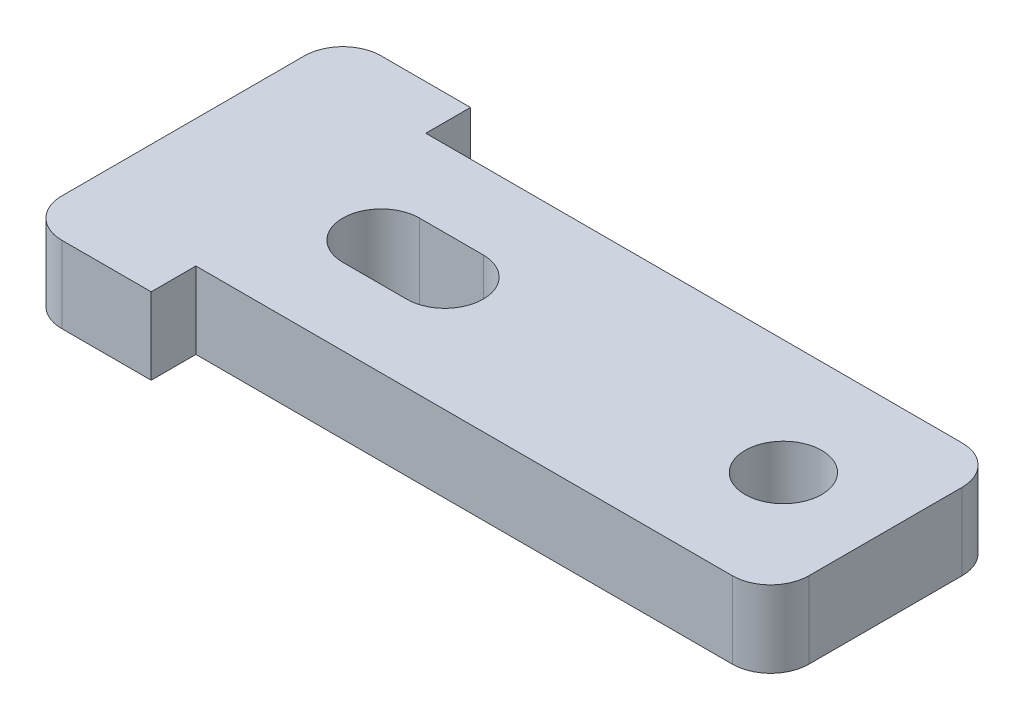
ISO-10303-21;
HEADER;
FILE_DESCRIPTION(('STEP AP214'),'2;1');
FILE_NAME('part.step','',(''),(''),'','','');
FILE_SCHEMA(('AUTOMOTIVE_DESIGN { 1 0 10303 214 1 1 1 1 }'));
ENDSEC;
DATA;
#1=APPLICATION_CONTEXT('core data for automotive mechanical design processes');
#2=APPLICATION_PROTOCOL_DEFINITION('international standard','automotive_design',2000,#1);
#3=PRODUCT_CONTEXT('',#1,'mechanical');
#4=PRODUCT('Part','Part','',(#3));
#5=PRODUCT_RELATED_PRODUCT_CATEGORY('part','',(#4));
#6=PRODUCT_DEFINITION_FORMATION('','',#4);
#7=PRODUCT_DEFINITION_CONTEXT('part definition',#1,'design');
#8=PRODUCT_DEFINITION('design','',#6,#7);
#9=PRODUCT_DEFINITION_SHAPE('','',#8);
#10=(LENGTH_UNIT() NAMED_UNIT(*) SI_UNIT(.MILLI.,.METRE.));
#11=(NAMED_UNIT(*) PLANE_ANGLE_UNIT() SI_UNIT($,.RADIAN.));
#12=(NAMED_UNIT(*) SI_UNIT($,.STERADIAN.) SOLID_ANGLE_UNIT());
#13=UNCERTAINTY_MEASURE_WITH_UNIT(LENGTH_MEASURE(1.E-05),#10,'distance_accuracy_value','');
#14=(GEOMETRIC_REPRESENTATION_CONTEXT(3) GLOBAL_UNCERTAINTY_ASSIGNED_CONTEXT((#13)) GLOBAL_UNIT_ASSIGNED_CONTEXT((#10,
#11,#12)) REPRESENTATION_CONTEXT('',''));
#15=CARTESIAN_POINT('',(0.,0.,0.));
#16=DIRECTION('',(0.,0.,1.));
#17=DIRECTION('',(1.,0.,0.));
#18=AXIS2_PLACEMENT_3D('',#15,#16,#17);
#19=CARTESIAN_POINT('',(26.,3.,-3.));
#20=DIRECTION('',(0.,1.,0.));
#21=DIRECTION('',(0.,0.,1.));
#22=AXIS2_PLACEMENT_3D('',#19,#20,#21);
#23=PLANE('',#22);
#24=DIRECTION('',(1.,0.,0.));
#25=VECTOR('',#24,1.);
#26=CARTESIAN_POINT('',(7.75,3.,1.5));
#27=LINE('',#26,#25);
#28=CARTESIAN_POINT('',(7.75,3.,1.5));
#29=VERTEX_POINT('',#28);
#30=CARTESIAN_POINT('',(10.25,3.,1.5));
#31=VERTEX_POINT('',#30);
#32=EDGE_CURVE('E162',#29,#31,#27,.T.);
#33=ORIENTED_EDGE('',*,*,#32,.F.);
#34=CARTESIAN_POINT('',(7.75,3.,0.));
#35=DIRECTION('',(0.,1.,0.));
#36=DIRECTION('',(0.,0.,1.));
#37=AXIS2_PLACEMENT_3D('',#34,#35,#36);
#38=CIRCLE('',#37,1.5);
#39=CARTESIAN_POINT('',(7.75,3.,-1.5));
#40=VERTEX_POINT('',#39);
#41=EDGE_CURVE('E153',#40,#29,#38,.T.);
#42=ORIENTED_EDGE('',*,*,#41,.F.);
#43=DIRECTION('',(-1.,0.,0.));
#44=VECTOR('',#43,1.);
#45=CARTESIAN_POINT('',(7.75,3.,-1.5));
#46=LINE('',#45,#44);
#47=CARTESIAN_POINT('',(10.25,3.,-1.5));
#48=VERTEX_POINT('',#47);
#49=EDGE_CURVE('E180',#48,#40,#46,.T.);
#50=ORIENTED_EDGE('',*,*,#49,.F.);
#51=CARTESIAN_POINT('',(10.25,3.,0.));
#52=DIRECTION('',(0.,1.,0.));
#53=DIRECTION('',(0.,0.,1.));
#54=AXIS2_PLACEMENT_3D('',#51,#52,#53);
#55=CIRCLE('',#54,1.5);
#56=EDGE_CURVE('E176',#31,#48,#55,.T.);
#57=ORIENTED_EDGE('',*,*,#56,.F.);
#58=EDGE_LOOP('',(#33,#42,#50,#57));
#59=FACE_BOUND('',#58,.T.);
#60=DIRECTION('',(0.,0.,-1.));
#61=VECTOR('',#60,1.);
#62=CARTESIAN_POINT('',(5.,3.,-6.25));
#63=LINE('',#62,#61);
#64=CARTESIAN_POINT('',(5.,3.,-4.5));
#65=VERTEX_POINT('',#64);
#66=CARTESIAN_POINT('',(5.,3.,-6.25));
#67=VERTEX_POINT('',#66);
#68=EDGE_CURVE('E204',#65,#67,#63,.T.);
#69=ORIENTED_EDGE('',*,*,#68,.T.);
#70=DIRECTION('',(-1.,0.,0.));
#71=VECTOR('',#70,1.);
#72=CARTESIAN_POINT('',(1.5,3.,-6.25));
#73=LINE('',#72,#71);
#74=CARTESIAN_POINT('',(1.5,3.,-6.25));
#75=VERTEX_POINT('',#74);
#76=EDGE_CURVE('E208',#67,#75,#73,.T.);
#77=ORIENTED_EDGE('',*,*,#76,.T.);
#78=CARTESIAN_POINT('',(1.5,3.,-4.75));
#79=DIRECTION('',(0.,1.,0.));
#80=DIRECTION('',(0.,0.,-1.));
#81=AXIS2_PLACEMENT_3D('',#78,#79,#80);
#82=CIRCLE('',#81,1.5);
#83=CARTESIAN_POINT('',(0.,3.,-4.75));
#84=VERTEX_POINT('',#83);
#85=EDGE_CURVE('E212',#75,#84,#82,.T.);
#86=ORIENTED_EDGE('',*,*,#85,.T.);
#87=DIRECTION('',(0.,0.,1.));
#88=VECTOR('',#87,1.);
#89=CARTESIAN_POINT('',(0.,3.,-4.75));
#90=LINE('',#89,#88);
#91=CARTESIAN_POINT('',(0.,3.,4.75));
#92=VERTEX_POINT('',#91);
#93=EDGE_CURVE('E215',#84,#92,#90,.T.);
#94=ORIENTED_EDGE('',*,*,#93,.T.);
#95=CARTESIAN_POINT('',(1.5,3.,4.75));
#96=DIRECTION('',(0.,1.,0.));
#97=DIRECTION('',(0.,0.,-1.));
#98=AXIS2_PLACEMENT_3D('',#95,#96,#97);
#99=CIRCLE('',#98,1.5);
#100=CARTESIAN_POINT('',(1.5,3.,6.25));
#101=VERTEX_POINT('',#100);
#102=EDGE_CURVE('E218',#92,#101,#99,.T.);
#103=ORIENTED_EDGE('',*,*,#102,.T.);
#104=DIRECTION('',(1.,0.,0.));
#105=VECTOR('',#104,1.);
#106=CARTESIAN_POINT('',(5.,3.,6.25));
#107=LINE('',#106,#105);
#108=CARTESIAN_POINT('',(5.,3.,6.25));
#109=VERTEX_POINT('',#108);
#110=EDGE_CURVE('E221',#101,#109,#107,.T.);
#111=ORIENTED_EDGE('',*,*,#110,.T.);
#112=DIRECTION('',(0.,0.,-1.));
#113=VECTOR('',#112,1.);
#114=CARTESIAN_POINT('',(5.,3.,4.5));
#115=LINE('',#114,#113);
#116=CARTESIAN_POINT('',(5.,3.,4.5));
#117=VERTEX_POINT('',#116);
#118=EDGE_CURVE('E224',#109,#117,#115,.T.);
#119=ORIENTED_EDGE('',*,*,#118,.T.);
#120=DIRECTION('',(1.,0.,0.));
#121=VECTOR('',#120,1.);
#122=CARTESIAN_POINT('',(26.,3.,4.5));
#123=LINE('',#122,#121);
#124=CARTESIAN_POINT('',(26.,3.,4.5));
#125=VERTEX_POINT('',#124);
#126=EDGE_CURVE('E227',#117,#125,#123,.T.);
#127=ORIENTED_EDGE('',*,*,#126,.T.);
#128=CARTESIAN_POINT('',(26.,3.,3.));
#129=DIRECTION('',(0.,1.,0.));
#130=DIRECTION('',(0.,0.,-1.));
#131=AXIS2_PLACEMENT_3D('',#128,#129,#130);
#132=CIRCLE('',#131,1.5);
#133=CARTESIAN_POINT('',(27.5,3.,3.));
#134=VERTEX_POINT('',#133);
#135=EDGE_CURVE('E230',#125,#134,#132,.T.);
#136=ORIENTED_EDGE('',*,*,#135,.T.);
#137=DIRECTION('',(0.,0.,-1.));
#138=VECTOR('',#137,1.);
#139=CARTESIAN_POINT('',(27.5,3.,-3.));
#140=LINE('',#139,#138);
#141=CARTESIAN_POINT('',(27.5,3.,-3.));
#142=VERTEX_POINT('',#141);
#143=EDGE_CURVE('E233',#134,#142,#140,.T.);
#144=ORIENTED_EDGE('',*,*,#143,.T.);
#145=CARTESIAN_POINT('',(26.,3.,-3.));
#146=DIRECTION('',(0.,1.,0.));
#147=DIRECTION('',(0.,0.,1.));
#148=AXIS2_PLACEMENT_3D('',#145,#146,#147);
#149=CIRCLE('',#148,1.5);
#150=CARTESIAN_POINT('',(26.,3.,-4.5));
#151=VERTEX_POINT('',#150);
#152=EDGE_CURVE('E236',#142,#151,#149,.T.);
#153=ORIENTED_EDGE('',*,*,#152,.T.);
#154=DIRECTION('',(-1.,0.,0.));
#155=VECTOR('',#154,1.);
#156=CARTESIAN_POINT('',(5.,3.,-4.5));
#157=LINE('',#156,#155);
#158=EDGE_CURVE('E239',#151,#65,#157,.T.);
#159=ORIENTED_EDGE('',*,*,#158,.T.);
#160=EDGE_LOOP('',(#69,#77,#86,#94,#103,#111,#119,#127,#136,#144,#153,#159));
#161=FACE_BOUND('',#160,.T.);
#162=CARTESIAN_POINT('',(23.5,3.,0.));
#163=DIRECTION('',(0.,1.,0.));
#164=DIRECTION('',(0.,0.,1.));
#165=AXIS2_PLACEMENT_3D('',#162,#163,#164);
#166=CIRCLE('',#165,1.5);
#167=CARTESIAN_POINT('',(23.5,3.,1.5));
#168=VERTEX_POINT('',#167);
#169=EDGE_CURVE('E188',#168,#168,#166,.T.);
#170=ORIENTED_EDGE('',*,*,#169,.F.);
#171=EDGE_LOOP('',(#170));
#172=FACE_BOUND('',#171,.T.);
#173=ADVANCED_FACE('F39',(#59,#161,#172),#23,.T.);
#174=CARTESIAN_POINT('',(26.,0.,-3.));
#175=DIRECTION('',(0.,1.,0.));
#176=DIRECTION('',(0.,0.,1.));
#177=AXIS2_PLACEMENT_3D('',#174,#175,#176);
#178=PLANE('',#177);
#179=DIRECTION('',(0.,0.,-1.));
#180=VECTOR('',#179,1.);
#181=CARTESIAN_POINT('',(5.,0.,-6.25));
#182=LINE('',#181,#180);
#183=CARTESIAN_POINT('',(5.,0.,-4.5));
#184=VERTEX_POINT('',#183);
#185=CARTESIAN_POINT('',(5.,0.,-6.25));
#186=VERTEX_POINT('',#185);
#187=EDGE_CURVE('E171',#184,#186,#182,.T.);
#188=ORIENTED_EDGE('',*,*,#187,.F.);
#189=DIRECTION('',(-1.,0.,0.));
#190=VECTOR('',#189,1.);
#191=CARTESIAN_POINT('',(5.,0.,-4.5));
#192=LINE('',#191,#190);
#193=CARTESIAN_POINT('',(26.,0.,-4.5));
#194=VERTEX_POINT('',#193);
#195=EDGE_CURVE('E209',#194,#184,#192,.T.);
#196=ORIENTED_EDGE('',*,*,#195,.F.);
#197=CARTESIAN_POINT('',(26.,0.,-3.));
#198=DIRECTION('',(0.,1.,0.));
#199=DIRECTION('',(0.,0.,1.));
#200=AXIS2_PLACEMENT_3D('',#197,#198,#199);
#201=CIRCLE('',#200,1.5);
#202=CARTESIAN_POINT('',(27.5,0.,-3.));
#203=VERTEX_POINT('',#202);
#204=EDGE_CURVE('E273',#203,#194,#201,.T.);
#205=ORIENTED_EDGE('',*,*,#204,.F.);
#206=DIRECTION('',(0.,0.,-1.));
#207=VECTOR('',#206,1.);
#208=CARTESIAN_POINT('',(27.5,0.,-3.));
#209=LINE('',#208,#207);
#210=CARTESIAN_POINT('',(27.5,0.,3.));
#211=VERTEX_POINT('',#210);
#212=EDGE_CURVE('E270',#211,#203,#209,.T.);
#213=ORIENTED_EDGE('',*,*,#212,.F.);
#214=CARTESIAN_POINT('',(26.,0.,3.));
#215=DIRECTION('',(0.,1.,0.));
#216=DIRECTION('',(0.,0.,-1.));
#217=AXIS2_PLACEMENT_3D('',#214,#215,#216);
#218=CIRCLE('',#217,1.5);
#219=CARTESIAN_POINT('',(26.,0.,4.5));
#220=VERTEX_POINT('',#219);
#221=EDGE_CURVE('E267',#220,#211,#218,.T.);
#222=ORIENTED_EDGE('',*,*,#221,.F.);
#223=DIRECTION('',(1.,0.,0.));
#224=VECTOR('',#223,1.);
#225=CARTESIAN_POINT('',(26.,0.,4.5));
#226=LINE('',#225,#224);
#227=CARTESIAN_POINT('',(5.,0.,4.5));
#228=VERTEX_POINT('',#227);
#229=EDGE_CURVE('E264',#228,#220,#226,.T.);
#230=ORIENTED_EDGE('',*,*,#229,.F.);
#231=DIRECTION('',(0.,0.,-1.));
#232=VECTOR('',#231,1.);
#233=CARTESIAN_POINT('',(5.,0.,4.5));
#234=LINE('',#233,#232);
#235=CARTESIAN_POINT('',(5.,0.,6.25));
#236=VERTEX_POINT('',#235);
#237=EDGE_CURVE('E261',#236,#228,#234,.T.);
#238=ORIENTED_EDGE('',*,*,#237,.F.);
#239=DIRECTION('',(1.,0.,0.));
#240=VECTOR('',#239,1.);
#241=CARTESIAN_POINT('',(5.,0.,6.25));
#242=LINE('',#241,#240);
#243=CARTESIAN_POINT('',(1.5,0.,6.25));
#244=VERTEX_POINT('',#243);
#245=EDGE_CURVE('E258',#244,#236,#242,.T.);
#246=ORIENTED_EDGE('',*,*,#245,.F.);
#247=CARTESIAN_POINT('',(1.5,0.,4.75));
#248=DIRECTION('',(0.,1.,0.));
#249=DIRECTION('',(0.,0.,-1.));
#250=AXIS2_PLACEMENT_3D('',#247,#248,#249);
#251=CIRCLE('',#250,1.5);
#252=CARTESIAN_POINT('',(0.,0.,4.75));
#253=VERTEX_POINT('',#252);
#254=EDGE_CURVE('E255',#253,#244,#251,.T.);
#255=ORIENTED_EDGE('',*,*,#254,.F.);
#256=DIRECTION('',(0.,0.,1.));
#257=VECTOR('',#256,1.);
#258=CARTESIAN_POINT('',(0.,0.,-4.75));
#259=LINE('',#258,#257);
#260=CARTESIAN_POINT('',(0.,0.,-4.75));
#261=VERTEX_POINT('',#260);
#262=EDGE_CURVE('E252',#261,#253,#259,.T.);
#263=ORIENTED_EDGE('',*,*,#262,.F.);
#264=CARTESIAN_POINT('',(1.5,0.,-4.75));
#265=DIRECTION('',(0.,1.,0.));
#266=DIRECTION('',(0.,0.,-1.));
#267=AXIS2_PLACEMENT_3D('',#264,#265,#266);
#268=CIRCLE('',#267,1.5);
#269=CARTESIAN_POINT('',(1.5,0.,-6.25));
#270=VERTEX_POINT('',#269);
#271=EDGE_CURVE('E249',#270,#261,#268,.T.);
#272=ORIENTED_EDGE('',*,*,#271,.F.);
#273=DIRECTION('',(-1.,0.,0.));
#274=VECTOR('',#273,1.);
#275=CARTESIAN_POINT('',(1.5,0.,-6.25));
#276=LINE('',#275,#274);
#277=EDGE_CURVE('E246',#186,#270,#276,.T.);
#278=ORIENTED_EDGE('',*,*,#277,.F.);
#279=EDGE_LOOP('',(#188,#196,#205,#213,#222,#230,#238,#246,#255,#263,#272,#278));
#280=FACE_BOUND('',#279,.T.);
#281=CARTESIAN_POINT('',(7.75,0.,0.));
#282=DIRECTION('',(0.,1.,0.));
#283=DIRECTION('',(0.,0.,1.));
#284=AXIS2_PLACEMENT_3D('',#281,#282,#283);
#285=CIRCLE('',#284,1.5);
#286=CARTESIAN_POINT('',(7.75,0.,-1.5));
#287=VERTEX_POINT('',#286);
#288=CARTESIAN_POINT('',(7.75,0.,1.5));
#289=VERTEX_POINT('',#288);
#290=EDGE_CURVE('E63',#287,#289,#285,.T.);
#291=ORIENTED_EDGE('',*,*,#290,.T.);
#292=DIRECTION('',(1.,0.,0.));
#293=VECTOR('',#292,1.);
#294=CARTESIAN_POINT('',(7.75,0.,1.5));
#295=LINE('',#294,#293);
#296=CARTESIAN_POINT('',(10.25,0.,1.5));
#297=VERTEX_POINT('',#296);
#298=EDGE_CURVE('E169',#289,#297,#295,.T.);
#299=ORIENTED_EDGE('',*,*,#298,.T.);
#300=CARTESIAN_POINT('',(10.25,0.,0.));
#301=DIRECTION('',(0.,1.,0.));
#302=DIRECTION('',(0.,0.,1.));
#303=AXIS2_PLACEMENT_3D('',#300,#301,#302);
#304=CIRCLE('',#303,1.5);
#305=CARTESIAN_POINT('',(10.25,0.,-1.5));
#306=VERTEX_POINT('',#305);
#307=EDGE_CURVE('E191',#297,#306,#304,.T.);
#308=ORIENTED_EDGE('',*,*,#307,.T.);
#309=DIRECTION('',(-1.,0.,0.));
#310=VECTOR('',#309,1.);
#311=CARTESIAN_POINT('',(7.75,0.,-1.5));
#312=LINE('',#311,#310);
#313=EDGE_CURVE('E163',#306,#287,#312,.T.);
#314=ORIENTED_EDGE('',*,*,#313,.T.);
#315=EDGE_LOOP('',(#291,#299,#308,#314));
#316=FACE_BOUND('',#315,.T.);
#317=CARTESIAN_POINT('',(23.5,0.,0.));
#318=DIRECTION('',(0.,1.,0.));
#319=DIRECTION('',(0.,0.,1.));
#320=AXIS2_PLACEMENT_3D('',#317,#318,#319);
#321=CIRCLE('',#320,1.5);
#322=CARTESIAN_POINT('',(23.5,0.,1.5));
#323=VERTEX_POINT('',#322);
#324=EDGE_CURVE('E539',#323,#323,#321,.T.);
#325=ORIENTED_EDGE('',*,*,#324,.T.);
#326=EDGE_LOOP('',(#325));
#327=FACE_BOUND('',#326,.T.);
#328=ADVANCED_FACE('F328',(#280,#316,#327),#178,.F.);
#329=CARTESIAN_POINT('',(5.,3.,-6.25));
#330=DIRECTION('',(-1.,0.,0.));
#331=DIRECTION('',(0.,0.,1.));
#332=AXIS2_PLACEMENT_3D('',#329,#330,#331);
#333=PLANE('',#332);
#334=ORIENTED_EDGE('',*,*,#187,.T.);
#335=DIRECTION('',(0.,-1.,0.));
#336=VECTOR('',#335,1.);
#337=CARTESIAN_POINT('',(5.,3.,-6.25));
#338=LINE('',#337,#336);
#339=EDGE_CURVE('E11',#67,#186,#338,.T.);
#340=ORIENTED_EDGE('',*,*,#339,.F.);
#341=ORIENTED_EDGE('',*,*,#68,.F.);
#342=DIRECTION('',(0.,-1.,0.));
#343=VECTOR('',#342,1.);
#344=CARTESIAN_POINT('',(5.,3.,-4.5));
#345=LINE('',#344,#343);
#346=EDGE_CURVE('E242',#65,#184,#345,.T.);
#347=ORIENTED_EDGE('',*,*,#346,.T.);
#348=EDGE_LOOP('',(#334,#340,#341,#347));
#349=FACE_BOUND('',#348,.T.);
#350=ADVANCED_FACE('F41',(#349),#333,.F.);
#351=CARTESIAN_POINT('',(1.5,3.,-6.25));
#352=DIRECTION('',(0.,0.,1.));
#353=DIRECTION('',(1.,0.,0.));
#354=AXIS2_PLACEMENT_3D('',#351,#352,#353);
#355=PLANE('',#354);
#356=ORIENTED_EDGE('',*,*,#277,.T.);
#357=DIRECTION('',(0.,-1.,0.));
#358=VECTOR('',#357,1.);
#359=CARTESIAN_POINT('',(1.5,3.,-6.25));
#360=LINE('',#359,#358);
#361=EDGE_CURVE('E48',#75,#270,#360,.T.);
#362=ORIENTED_EDGE('',*,*,#361,.F.);
#363=ORIENTED_EDGE('',*,*,#76,.F.);
#364=ORIENTED_EDGE('',*,*,#339,.T.);
#365=EDGE_LOOP('',(#356,#362,#363,#364));
#366=FACE_BOUND('',#365,.T.);
#367=ADVANCED_FACE('F345',(#366),#355,.F.);
#368=CARTESIAN_POINT('',(1.5,3.,-4.75));
#369=DIRECTION('',(0.,-1.,0.));
#370=DIRECTION('',(0.,0.,-1.));
#371=AXIS2_PLACEMENT_3D('',#368,#369,#370);
#372=CYLINDRICAL_SURFACE('',#371,1.5);
#373=ORIENTED_EDGE('',*,*,#271,.T.);
#374=DIRECTION('',(0.,-1.,0.));
#375=VECTOR('',#374,1.);
#376=CARTESIAN_POINT('',(0.,3.,-4.75));
#377=LINE('',#376,#375);
#378=EDGE_CURVE('E313',#84,#261,#377,.T.);
#379=ORIENTED_EDGE('',*,*,#378,.F.);
#380=ORIENTED_EDGE('',*,*,#85,.F.);
#381=ORIENTED_EDGE('',*,*,#361,.T.);
#382=EDGE_LOOP('',(#373,#379,#380,#381));
#383=FACE_BOUND('',#382,.T.);
#384=ADVANCED_FACE('F322',(#383),#372,.T.);
#385=CARTESIAN_POINT('',(0.,3.,-4.75));
#386=DIRECTION('',(1.,0.,0.));
#387=DIRECTION('',(0.,0.,-1.));
#388=AXIS2_PLACEMENT_3D('',#385,#386,#387);
#389=PLANE('',#388);
#390=ORIENTED_EDGE('',*,*,#262,.T.);
#391=DIRECTION('',(0.,-1.,0.));
#392=VECTOR('',#391,1.);
#393=CARTESIAN_POINT('',(0.,3.,4.75));
#394=LINE('',#393,#392);
#395=EDGE_CURVE('E309',#92,#253,#394,.T.);
#396=ORIENTED_EDGE('',*,*,#395,.F.);
#397=ORIENTED_EDGE('',*,*,#93,.F.);
#398=ORIENTED_EDGE('',*,*,#378,.T.);
#399=EDGE_LOOP('',(#390,#396,#397,#398));
#400=FACE_BOUND('',#399,.T.);
#401=ADVANCED_FACE('F334',(#400),#389,.F.);
#402=CARTESIAN_POINT('',(1.5,3.,4.75));
#403=DIRECTION('',(0.,-1.,0.));
#404=DIRECTION('',(0.,0.,-1.));
#405=AXIS2_PLACEMENT_3D('',#402,#403,#404);
#406=CYLINDRICAL_SURFACE('',#405,1.5);
#407=ORIENTED_EDGE('',*,*,#254,.T.);
#408=DIRECTION('',(0.,-1.,0.));
#409=VECTOR('',#408,1.);
#410=CARTESIAN_POINT('',(1.5,3.,6.25));
#411=LINE('',#410,#409);
#412=EDGE_CURVE('E305',#101,#244,#411,.T.);
#413=ORIENTED_EDGE('',*,*,#412,.F.);
#414=ORIENTED_EDGE('',*,*,#102,.F.);
#415=ORIENTED_EDGE('',*,*,#395,.T.);
#416=EDGE_LOOP('',(#407,#413,#414,#415));
#417=FACE_BOUND('',#416,.T.);
#418=ADVANCED_FACE('F338',(#417),#406,.T.);
#419=CARTESIAN_POINT('',(5.,3.,6.25));
#420=DIRECTION('',(0.,0.,-1.));
#421=DIRECTION('',(-1.,0.,0.));
#422=AXIS2_PLACEMENT_3D('',#419,#420,#421);
#423=PLANE('',#422);
#424=ORIENTED_EDGE('',*,*,#245,.T.);
#425=DIRECTION('',(0.,-1.,0.));
#426=VECTOR('',#425,1.);
#427=CARTESIAN_POINT('',(5.,3.,6.25));
#428=LINE('',#427,#426);
#429=EDGE_CURVE('E301',#109,#236,#428,.T.);
#430=ORIENTED_EDGE('',*,*,#429,.F.);
#431=ORIENTED_EDGE('',*,*,#110,.F.);
#432=ORIENTED_EDGE('',*,*,#412,.T.);
#433=EDGE_LOOP('',(#424,#430,#431,#432));
#434=FACE_BOUND('',#433,.T.);
#435=ADVANCED_FACE('F378',(#434),#423,.F.);
#436=CARTESIAN_POINT('',(5.,3.,4.5));
#437=DIRECTION('',(-1.,0.,0.));
#438=DIRECTION('',(0.,0.,1.));
#439=AXIS2_PLACEMENT_3D('',#436,#437,#438);
#440=PLANE('',#439);
#441=ORIENTED_EDGE('',*,*,#237,.T.);
#442=DIRECTION('',(0.,-1.,0.));
#443=VECTOR('',#442,1.);
#444=CARTESIAN_POINT('',(5.,3.,4.5));
#445=LINE('',#444,#443);
#446=EDGE_CURVE('E297',#117,#228,#445,.T.);
#447=ORIENTED_EDGE('',*,*,#446,.F.);
#448=ORIENTED_EDGE('',*,*,#118,.F.);
#449=ORIENTED_EDGE('',*,*,#429,.T.);
#450=EDGE_LOOP('',(#441,#447,#448,#449));
#451=FACE_BOUND('',#450,.T.);
#452=ADVANCED_FACE('F376',(#451),#440,.F.);
#453=CARTESIAN_POINT('',(26.,3.,4.5));
#454=DIRECTION('',(0.,0.,-1.));
#455=DIRECTION('',(-1.,0.,0.));
#456=AXIS2_PLACEMENT_3D('',#453,#454,#455);
#457=PLANE('',#456);
#458=ORIENTED_EDGE('',*,*,#229,.T.);
#459=DIRECTION('',(0.,-1.,0.));
#460=VECTOR('',#459,1.);
#461=CARTESIAN_POINT('',(26.,3.,4.5));
#462=LINE('',#461,#460);
#463=EDGE_CURVE('E293',#125,#220,#462,.T.);
#464=ORIENTED_EDGE('',*,*,#463,.F.);
#465=ORIENTED_EDGE('',*,*,#126,.F.);
#466=ORIENTED_EDGE('',*,*,#446,.T.);
#467=EDGE_LOOP('',(#458,#464,#465,#466));
#468=FACE_BOUND('',#467,.T.);
#469=ADVANCED_FACE('F372',(#468),#457,.F.);
#470=CARTESIAN_POINT('',(26.,3.,3.));
#471=DIRECTION('',(0.,-1.,0.));
#472=DIRECTION('',(0.,0.,-1.));
#473=AXIS2_PLACEMENT_3D('',#470,#471,#472);
#474=CYLINDRICAL_SURFACE('',#473,1.5);
#475=ORIENTED_EDGE('',*,*,#221,.T.);
#476=DIRECTION('',(0.,-1.,0.));
#477=VECTOR('',#476,1.);
#478=CARTESIAN_POINT('',(27.5,3.,3.));
#479=LINE('',#478,#477);
#480=EDGE_CURVE('E289',#134,#211,#479,.T.);
#481=ORIENTED_EDGE('',*,*,#480,.F.);
#482=ORIENTED_EDGE('',*,*,#135,.F.);
#483=ORIENTED_EDGE('',*,*,#463,.T.);
#484=EDGE_LOOP('',(#475,#481,#482,#483));
#485=FACE_BOUND('',#484,.T.);
#486=ADVANCED_FACE('F367',(#485),#474,.T.);
#487=CARTESIAN_POINT('',(27.5,3.,-3.));
#488=DIRECTION('',(-1.,0.,0.));
#489=DIRECTION('',(0.,0.,1.));
#490=AXIS2_PLACEMENT_3D('',#487,#488,#489);
#491=PLANE('',#490);
#492=ORIENTED_EDGE('',*,*,#212,.T.);
#493=DIRECTION('',(0.,-1.,0.));
#494=VECTOR('',#493,1.);
#495=CARTESIAN_POINT('',(27.5,3.,-3.));
#496=LINE('',#495,#494);
#497=EDGE_CURVE('E285',#142,#203,#496,.T.);
#498=ORIENTED_EDGE('',*,*,#497,.F.);
#499=ORIENTED_EDGE('',*,*,#143,.F.);
#500=ORIENTED_EDGE('',*,*,#480,.T.);
#501=EDGE_LOOP('',(#492,#498,#499,#500));
#502=FACE_BOUND('',#501,.T.);
#503=ADVANCED_FACE('F361',(#502),#491,.F.);
#504=CARTESIAN_POINT('',(26.,3.,-3.));
#505=DIRECTION('',(0.,-1.,0.));
#506=DIRECTION('',(0.,0.,-1.));
#507=AXIS2_PLACEMENT_3D('',#504,#505,#506);
#508=CYLINDRICAL_SURFACE('',#507,1.5);
#509=ORIENTED_EDGE('',*,*,#204,.T.);
#510=DIRECTION('',(0.,-1.,0.));
#511=VECTOR('',#510,1.);
#512=CARTESIAN_POINT('',(26.,3.,-4.5));
#513=LINE('',#512,#511);
#514=EDGE_CURVE('E281',#151,#194,#513,.T.);
#515=ORIENTED_EDGE('',*,*,#514,.F.);
#516=ORIENTED_EDGE('',*,*,#152,.F.);
#517=ORIENTED_EDGE('',*,*,#497,.T.);
#518=EDGE_LOOP('',(#509,#515,#516,#517));
#519=FACE_BOUND('',#518,.T.);
#520=ADVANCED_FACE('F357',(#519),#508,.T.);
#521=CARTESIAN_POINT('',(5.,3.,-4.5));
#522=DIRECTION('',(0.,0.,1.));
#523=DIRECTION('',(1.,0.,0.));
#524=AXIS2_PLACEMENT_3D('',#521,#522,#523);
#525=PLANE('',#524);
#526=ORIENTED_EDGE('',*,*,#195,.T.);
#527=ORIENTED_EDGE('',*,*,#346,.F.);
#528=ORIENTED_EDGE('',*,*,#158,.F.);
#529=ORIENTED_EDGE('',*,*,#514,.T.);
#530=EDGE_LOOP('',(#526,#527,#528,#529));
#531=FACE_BOUND('',#530,.T.);
#532=ADVANCED_FACE('F352',(#531),#525,.F.);
#533=CARTESIAN_POINT('',(7.75,3.,0.));
#534=DIRECTION('',(0.,-1.,0.));
#535=DIRECTION('',(0.,0.,-1.));
#536=AXIS2_PLACEMENT_3D('',#533,#534,#535);
#537=CYLINDRICAL_SURFACE('',#536,1.5);
#538=ORIENTED_EDGE('',*,*,#290,.F.);
#539=DIRECTION('',(0.,-1.,0.));
#540=VECTOR('',#539,1.);
#541=CARTESIAN_POINT('',(7.75,3.,-1.5));
#542=LINE('',#541,#540);
#543=EDGE_CURVE('E157',#40,#287,#542,.T.);
#544=ORIENTED_EDGE('',*,*,#543,.F.);
#545=ORIENTED_EDGE('',*,*,#41,.T.);
#546=DIRECTION('',(0.,-1.,0.));
#547=VECTOR('',#546,1.);
#548=CARTESIAN_POINT('',(7.75,3.,1.5));
#549=LINE('',#548,#547);
#550=EDGE_CURVE('E156',#29,#289,#549,.T.);
#551=ORIENTED_EDGE('',*,*,#550,.T.);
#552=EDGE_LOOP('',(#538,#544,#545,#551));
#553=FACE_BOUND('',#552,.T.);
#554=ADVANCED_FACE('F155',(#553),#537,.F.);
#555=CARTESIAN_POINT('',(7.75,3.,1.5));
#556=DIRECTION('',(0.,0.,-1.));
#557=DIRECTION('',(-1.,0.,0.));
#558=AXIS2_PLACEMENT_3D('',#555,#556,#557);
#559=PLANE('',#558);
#560=ORIENTED_EDGE('',*,*,#298,.F.);
#561=ORIENTED_EDGE('',*,*,#550,.F.);
#562=ORIENTED_EDGE('',*,*,#32,.T.);
#563=DIRECTION('',(0.,-1.,0.));
#564=VECTOR('',#563,1.);
#565=CARTESIAN_POINT('',(10.25,3.,1.5));
#566=LINE('',#565,#564);
#567=EDGE_CURVE('E172',#31,#297,#566,.T.);
#568=ORIENTED_EDGE('',*,*,#567,.T.);
#569=EDGE_LOOP('',(#560,#561,#562,#568));
#570=FACE_BOUND('',#569,.T.);
#571=ADVANCED_FACE('F166',(#570),#559,.T.);
#572=CARTESIAN_POINT('',(10.25,3.,0.));
#573=DIRECTION('',(0.,-1.,0.));
#574=DIRECTION('',(0.,0.,-1.));
#575=AXIS2_PLACEMENT_3D('',#572,#573,#574);
#576=CYLINDRICAL_SURFACE('',#575,1.5);
#577=ORIENTED_EDGE('',*,*,#307,.F.);
#578=ORIENTED_EDGE('',*,*,#567,.F.);
#579=ORIENTED_EDGE('',*,*,#56,.T.);
#580=DIRECTION('',(0.,-1.,0.));
#581=VECTOR('',#580,1.);
#582=CARTESIAN_POINT('',(10.25,3.,-1.5));
#583=LINE('',#582,#581);
#584=EDGE_CURVE('E55',#48,#306,#583,.T.);
#585=ORIENTED_EDGE('',*,*,#584,.T.);
#586=EDGE_LOOP('',(#577,#578,#579,#585));
#587=FACE_BOUND('',#586,.T.);
#588=ADVANCED_FACE('F436',(#587),#576,.F.);
#589=CARTESIAN_POINT('',(7.75,3.,-1.5));
#590=DIRECTION('',(0.,0.,1.));
#591=DIRECTION('',(1.,0.,0.));
#592=AXIS2_PLACEMENT_3D('',#589,#590,#591);
#593=PLANE('',#592);
#594=ORIENTED_EDGE('',*,*,#313,.F.);
#595=ORIENTED_EDGE('',*,*,#584,.F.);
#596=ORIENTED_EDGE('',*,*,#49,.T.);
#597=ORIENTED_EDGE('',*,*,#543,.T.);
#598=EDGE_LOOP('',(#594,#595,#596,#597));
#599=FACE_BOUND('',#598,.T.);
#600=ADVANCED_FACE('F442',(#599),#593,.T.);
#601=CARTESIAN_POINT('',(23.5,3.,0.));
#602=DIRECTION('',(0.,-1.,0.));
#603=DIRECTION('',(0.,0.,-1.));
#604=AXIS2_PLACEMENT_3D('',#601,#602,#603);
#605=CYLINDRICAL_SURFACE('',#604,1.5);
#606=ORIENTED_EDGE('',*,*,#169,.T.);
#607=EDGE_LOOP('',(#606));
#608=FACE_BOUND('',#607,.T.);
#609=ORIENTED_EDGE('',*,*,#324,.F.);
#610=EDGE_LOOP('',(#609));
#611=FACE_BOUND('',#610,.T.);
#612=ADVANCED_FACE('F450',(#608,#611),#605,.F.);
#613=CLOSED_SHELL('',(#173,#328,#350,#367,#384,#401,#418,#435,#452,#469,#486,#503,#520,#532,
#554,#571,#588,#600,#612));
#614=MANIFOLD_SOLID_BREP('B2',#613);
#615=ADVANCED_BREP_SHAPE_REPRESENTATION('',(#18,#614),#14);
#616=SHAPE_DEFINITION_REPRESENTATION(#9,#615);
ENDSEC;
END-ISO-10303-21;
